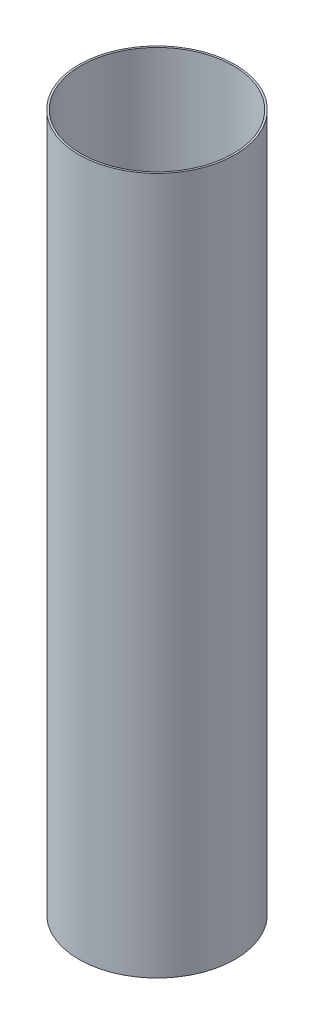
ISO-10303-21;
HEADER;
FILE_DESCRIPTION(('STEP AP214'),'2;1');
FILE_NAME('part.step','',(''),(''),'','','');
FILE_SCHEMA(('AUTOMOTIVE_DESIGN { 1 0 10303 214 1 1 1 1 }'));
ENDSEC;
DATA;
#1=APPLICATION_CONTEXT('core data for automotive mechanical design processes');
#2=APPLICATION_PROTOCOL_DEFINITION('international standard','automotive_design',2000,#1);
#3=PRODUCT_CONTEXT('',#1,'mechanical');
#4=PRODUCT('Part','Part','',(#3));
#5=PRODUCT_RELATED_PRODUCT_CATEGORY('part','',(#4));
#6=PRODUCT_DEFINITION_FORMATION('','',#4);
#7=PRODUCT_DEFINITION_CONTEXT('part definition',#1,'design');
#8=PRODUCT_DEFINITION('design','',#6,#7);
#9=PRODUCT_DEFINITION_SHAPE('','',#8);
#10=(LENGTH_UNIT() NAMED_UNIT(*) SI_UNIT(.MILLI.,.METRE.));
#11=(NAMED_UNIT(*) PLANE_ANGLE_UNIT() SI_UNIT($,.RADIAN.));
#12=(NAMED_UNIT(*) SI_UNIT($,.STERADIAN.) SOLID_ANGLE_UNIT());
#13=UNCERTAINTY_MEASURE_WITH_UNIT(LENGTH_MEASURE(1.E-05),#10,'distance_accuracy_value','');
#14=(GEOMETRIC_REPRESENTATION_CONTEXT(3) GLOBAL_UNCERTAINTY_ASSIGNED_CONTEXT((#13)) GLOBAL_UNIT_ASSIGNED_CONTEXT((#10,
#11,#12)) REPRESENTATION_CONTEXT('',''));
#15=CARTESIAN_POINT('',(0.,0.,0.));
#16=DIRECTION('',(0.,0.,1.));
#17=DIRECTION('',(1.,0.,0.));
#18=AXIS2_PLACEMENT_3D('',#15,#16,#17);
#19=CARTESIAN_POINT('',(0.,156.029411764,0.));
#20=DIRECTION('',(0.,-1.,0.));
#21=DIRECTION('',(0.,0.,-1.));
#22=AXIS2_PLACEMENT_3D('',#19,#20,#21);
#23=CYLINDRICAL_SURFACE('',#22,38.09999999952);
#24=CARTESIAN_POINT('',(0.,146.029411764,0.));
#25=DIRECTION('',(0.,1.,0.));
#26=DIRECTION('',(0.,0.,1.));
#27=AXIS2_PLACEMENT_3D('',#24,#25,#26);
#28=CIRCLE('',#27,38.09999999952);
#29=CARTESIAN_POINT('',(0.,146.029411764,38.09999999952));
#30=VERTEX_POINT('',#29);
#31=EDGE_CURVE('E10',#30,#30,#28,.T.);
#32=ORIENTED_EDGE('',*,*,#31,.F.);
#33=EDGE_LOOP('',(#32));
#34=FACE_BOUND('',#33,.T.);
#35=CARTESIAN_POINT('',(0.,-193.969411764,0.));
#36=DIRECTION('',(0.,-1.,0.));
#37=DIRECTION('',(0.,0.,-1.));
#38=AXIS2_PLACEMENT_3D('',#35,#36,#37);
#39=CIRCLE('',#38,38.09999999952);
#40=CARTESIAN_POINT('',(0.,-193.969411764,-38.09999999952));
#41=VERTEX_POINT('',#40);
#42=EDGE_CURVE('E43',#41,#41,#39,.T.);
#43=ORIENTED_EDGE('',*,*,#42,.F.);
#44=EDGE_LOOP('',(#43));
#45=FACE_BOUND('',#44,.T.);
#46=ADVANCED_FACE('F37',(#34,#45),#23,.T.);
#47=CARTESIAN_POINT('',(0.,146.029411764,0.));
#48=DIRECTION('',(0.,1.,0.));
#49=DIRECTION('',(0.,0.,1.));
#50=AXIS2_PLACEMENT_3D('',#47,#48,#49);
#51=PLANE('',#50);
#52=CARTESIAN_POINT('',(0.,146.029411764,0.));
#53=DIRECTION('',(0.,1.,0.));
#54=DIRECTION('',(0.,0.,1.));
#55=AXIS2_PLACEMENT_3D('',#52,#53,#54);
#56=CIRCLE('',#55,37.2000000000001);
#57=CARTESIAN_POINT('',(0.,146.029411764,37.2000000000001));
#58=VERTEX_POINT('',#57);
#59=EDGE_CURVE('E47',#58,#58,#56,.T.);
#60=ORIENTED_EDGE('',*,*,#59,.F.);
#61=EDGE_LOOP('',(#60));
#62=FACE_BOUND('',#61,.T.);
#63=ORIENTED_EDGE('',*,*,#31,.T.);
#64=EDGE_LOOP('',(#63));
#65=FACE_BOUND('',#64,.T.);
#66=ADVANCED_FACE('F61',(#62,#65),#51,.T.);
#67=CARTESIAN_POINT('',(0.,-193.969411764,0.));
#68=DIRECTION('',(0.,-1.,0.));
#69=DIRECTION('',(0.,0.,-1.));
#70=AXIS2_PLACEMENT_3D('',#67,#68,#69);
#71=PLANE('',#70);
#72=CARTESIAN_POINT('',(0.,-193.969411764,0.));
#73=DIRECTION('',(0.,-1.,0.));
#74=DIRECTION('',(0.,0.,-1.));
#75=AXIS2_PLACEMENT_3D('',#72,#73,#74);
#76=CIRCLE('',#75,37.2000000000001);
#77=CARTESIAN_POINT('',(0.,-193.969411764,-37.2000000000001));
#78=VERTEX_POINT('',#77);
#79=EDGE_CURVE('E51',#78,#78,#76,.T.);
#80=ORIENTED_EDGE('',*,*,#79,.F.);
#81=EDGE_LOOP('',(#80));
#82=FACE_BOUND('',#81,.T.);
#83=ORIENTED_EDGE('',*,*,#42,.T.);
#84=EDGE_LOOP('',(#83));
#85=FACE_BOUND('',#84,.T.);
#86=ADVANCED_FACE('F59',(#82,#85),#71,.T.);
#87=CARTESIAN_POINT('',(0.,261.246900804558,0.));
#88=DIRECTION('',(0.,-1.,0.));
#89=DIRECTION('',(0.,0.,-1.));
#90=AXIS2_PLACEMENT_3D('',#87,#88,#89);
#91=CYLINDRICAL_SURFACE('',#90,37.2000000000001);
#92=ORIENTED_EDGE('',*,*,#59,.T.);
#93=EDGE_LOOP('',(#92));
#94=FACE_BOUND('',#93,.T.);
#95=ORIENTED_EDGE('',*,*,#79,.T.);
#96=EDGE_LOOP('',(#95));
#97=FACE_BOUND('',#96,.T.);
#98=ADVANCED_FACE('F57',(#94,#97),#91,.F.);
#99=CLOSED_SHELL('',(#46,#66,#86,#98));
#100=MANIFOLD_SOLID_BREP('B2',#99);
#101=ADVANCED_BREP_SHAPE_REPRESENTATION('',(#18,#100),#14);
#102=SHAPE_DEFINITION_REPRESENTATION(#9,#101);
ENDSEC;
END-ISO-10303-21;
